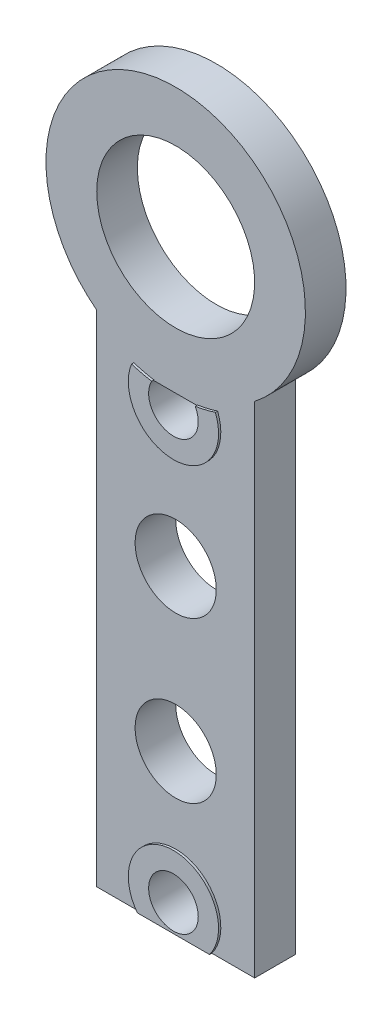
ISO-10303-21;
HEADER;
FILE_DESCRIPTION(('STEP AP214'),'2;1');
FILE_NAME('part.step','',(''),(''),'','','');
FILE_SCHEMA(('AUTOMOTIVE_DESIGN { 1 0 10303 214 1 1 1 1 }'));
ENDSEC;
DATA;
#1=APPLICATION_CONTEXT('core data for automotive mechanical design processes');
#2=APPLICATION_PROTOCOL_DEFINITION('international standard','automotive_design',2000,#1);
#3=PRODUCT_CONTEXT('',#1,'mechanical');
#4=PRODUCT('Part','Part','',(#3));
#5=PRODUCT_RELATED_PRODUCT_CATEGORY('part','',(#4));
#6=PRODUCT_DEFINITION_FORMATION('','',#4);
#7=PRODUCT_DEFINITION_CONTEXT('part definition',#1,'design');
#8=PRODUCT_DEFINITION('design','',#6,#7);
#9=PRODUCT_DEFINITION_SHAPE('','',#8);
#10=(LENGTH_UNIT() NAMED_UNIT(*) SI_UNIT(.MILLI.,.METRE.));
#11=(NAMED_UNIT(*) PLANE_ANGLE_UNIT() SI_UNIT($,.RADIAN.));
#12=(NAMED_UNIT(*) SI_UNIT($,.STERADIAN.) SOLID_ANGLE_UNIT());
#13=UNCERTAINTY_MEASURE_WITH_UNIT(LENGTH_MEASURE(1.E-05),#10,'distance_accuracy_value','');
#14=(GEOMETRIC_REPRESENTATION_CONTEXT(3) GLOBAL_UNCERTAINTY_ASSIGNED_CONTEXT((#13)) GLOBAL_UNIT_ASSIGNED_CONTEXT((#10,
#11,#12)) REPRESENTATION_CONTEXT('',''));
#15=CARTESIAN_POINT('',(0.,0.,0.));
#16=DIRECTION('',(0.,0.,1.));
#17=DIRECTION('',(1.,0.,0.));
#18=AXIS2_PLACEMENT_3D('',#15,#16,#17);
#19=CARTESIAN_POINT('',(-32.018684277368,-28.5,38.));
#20=DIRECTION('',(0.,0.,-1.));
#21=DIRECTION('',(-1.,0.,0.));
#22=AXIS2_PLACEMENT_3D('',#19,#20,#21);
#23=CYLINDRICAL_SURFACE('',#22,1.1);
#24=CARTESIAN_POINT('',(-32.018684277368,-28.5,35.));
#25=DIRECTION('',(0.,0.,1.));
#26=DIRECTION('',(1.,0.,0.));
#27=AXIS2_PLACEMENT_3D('',#24,#25,#26);
#28=CIRCLE('',#27,1.1);
#29=CARTESIAN_POINT('',(-31.0534155324063,-27.9725,35.));
#30=VERTEX_POINT('',#29);
#31=CARTESIAN_POINT('',(-32.9839530223297,-27.9725,35.));
#32=VERTEX_POINT('',#31);
#33=EDGE_CURVE('E174',#30,#32,#28,.F.);
#34=ORIENTED_EDGE('',*,*,#33,.F.);
#35=DIRECTION('',(0.,0.,-1.));
#36=VECTOR('',#35,1.);
#37=CARTESIAN_POINT('',(-31.0534155324063,-27.9725,36.05));
#38=LINE('',#37,#36);
#39=CARTESIAN_POINT('',(-31.0534155324063,-27.9725,34.9));
#40=VERTEX_POINT('',#39);
#41=EDGE_CURVE('E192',#30,#40,#38,.T.);
#42=ORIENTED_EDGE('',*,*,#41,.T.);
#43=CARTESIAN_POINT('',(-32.018684277368,-28.5,34.9));
#44=DIRECTION('',(0.,0.,1.));
#45=DIRECTION('',(1.,0.,0.));
#46=AXIS2_PLACEMENT_3D('',#43,#44,#45);
#47=CIRCLE('',#46,1.1);
#48=CARTESIAN_POINT('',(-31.0388883802547,-28.,34.9));
#49=VERTEX_POINT('',#48);
#50=EDGE_CURVE('E185',#49,#40,#47,.T.);
#51=ORIENTED_EDGE('',*,*,#50,.F.);
#52=DIRECTION('',(0.,0.,-1.));
#53=VECTOR('',#52,1.);
#54=CARTESIAN_POINT('',(-31.0388883802547,-28.,38.));
#55=LINE('',#54,#53);
#56=CARTESIAN_POINT('',(-31.0388883802547,-28.,33.1));
#57=VERTEX_POINT('',#56);
#58=EDGE_CURVE('E11',#49,#57,#55,.T.);
#59=ORIENTED_EDGE('',*,*,#58,.T.);
#60=CARTESIAN_POINT('',(-32.018684277368,-28.5,33.1));
#61=DIRECTION('',(0.,0.,-1.));
#62=DIRECTION('',(-1.,0.,0.));
#63=AXIS2_PLACEMENT_3D('',#60,#61,#62);
#64=CIRCLE('',#63,1.1);
#65=CARTESIAN_POINT('',(-32.9984801744813,-28.,33.1));
#66=VERTEX_POINT('',#65);
#67=EDGE_CURVE('E177',#66,#57,#64,.F.);
#68=ORIENTED_EDGE('',*,*,#67,.F.);
#69=DIRECTION('',(0.,0.,-1.));
#70=VECTOR('',#69,1.);
#71=CARTESIAN_POINT('',(-32.9984801744813,-28.,38.));
#72=LINE('',#71,#70);
#73=CARTESIAN_POINT('',(-32.9984801744813,-28.,34.9));
#74=VERTEX_POINT('',#73);
#75=EDGE_CURVE('E50',#66,#74,#72,.F.);
#76=ORIENTED_EDGE('',*,*,#75,.T.);
#77=CARTESIAN_POINT('',(-32.9839530223297,-27.9725,34.9));
#78=VERTEX_POINT('',#77);
#79=EDGE_CURVE('E184',#78,#74,#47,.T.);
#80=ORIENTED_EDGE('',*,*,#79,.F.);
#81=DIRECTION('',(0.,0.,-1.));
#82=VECTOR('',#81,1.);
#83=CARTESIAN_POINT('',(-32.9839530223297,-27.9725,36.05));
#84=LINE('',#83,#82);
#85=EDGE_CURVE('E135',#78,#32,#84,.F.);
#86=ORIENTED_EDGE('',*,*,#85,.T.);
#87=EDGE_LOOP('',(#34,#42,#51,#59,#68,#76,#80,#86));
#88=FACE_BOUND('',#87,.T.);
#89=ADVANCED_FACE('F41',(#88),#23,.F.);
#90=CARTESIAN_POINT('',(-32.018684277368,-28.5,35.));
#91=DIRECTION('',(0.,0.,-1.));
#92=DIRECTION('',(-1.,0.,0.));
#93=AXIS2_PLACEMENT_3D('',#90,#91,#92);
#94=CYLINDRICAL_SURFACE('',#93,2.);
#95=DIRECTION('',(0.,0.,-1.));
#96=VECTOR('',#95,1.);
#97=CARTESIAN_POINT('',(-30.1614646468673,-27.7578846153846,36.05));
#98=LINE('',#97,#96);
#99=CARTESIAN_POINT('',(-30.1614646468673,-27.7578846153846,35.));
#100=VERTEX_POINT('',#99);
#101=CARTESIAN_POINT('',(-30.1614646468673,-27.7578846153846,34.9));
#102=VERTEX_POINT('',#101);
#103=EDGE_CURVE('E210',#100,#102,#98,.T.);
#104=ORIENTED_EDGE('',*,*,#103,.F.);
#105=CARTESIAN_POINT('',(-32.018684277368,-28.5,35.));
#106=DIRECTION('',(0.,0.,1.));
#107=DIRECTION('',(1.,0.,0.));
#108=AXIS2_PLACEMENT_3D('',#105,#106,#107);
#109=CIRCLE('',#108,2.);
#110=CARTESIAN_POINT('',(-33.8759039078687,-27.7578846153846,35.));
#111=VERTEX_POINT('',#110);
#112=EDGE_CURVE('E149',#111,#100,#109,.T.);
#113=ORIENTED_EDGE('',*,*,#112,.F.);
#114=DIRECTION('',(0.,0.,-1.));
#115=VECTOR('',#114,1.);
#116=CARTESIAN_POINT('',(-33.8759039078687,-27.7578846153846,36.05));
#117=LINE('',#116,#115);
#118=CARTESIAN_POINT('',(-33.8759039078687,-27.7578846153846,34.9));
#119=VERTEX_POINT('',#118);
#120=EDGE_CURVE('E58',#119,#111,#117,.F.);
#121=ORIENTED_EDGE('',*,*,#120,.F.);
#122=CARTESIAN_POINT('',(-32.018684277368,-28.5,34.9));
#123=DIRECTION('',(0.,0.,1.));
#124=DIRECTION('',(1.,0.,0.));
#125=AXIS2_PLACEMENT_3D('',#122,#123,#124);
#126=CIRCLE('',#125,2.);
#127=EDGE_CURVE('E147',#119,#102,#126,.T.);
#128=ORIENTED_EDGE('',*,*,#127,.T.);
#129=EDGE_LOOP('',(#104,#113,#121,#128));
#130=FACE_BOUND('',#129,.T.);
#131=ADVANCED_FACE('F146',(#130),#94,.T.);
#132=CARTESIAN_POINT('',(-35.518684277368,-49.5,34.9));
#133=DIRECTION('',(1.,0.,0.));
#134=DIRECTION('',(0.,0.,-1.));
#135=AXIS2_PLACEMENT_3D('',#132,#133,#134);
#136=PLANE('',#135);
#137=DIRECTION('',(0.,0.,-1.));
#138=VECTOR('',#137,1.);
#139=CARTESIAN_POINT('',(-35.518684277368,-26.5620718977237,34.9));
#140=LINE('',#139,#138);
#141=CARTESIAN_POINT('',(-35.518684277368,-26.5620718977237,33.1));
#142=VERTEX_POINT('',#141);
#143=CARTESIAN_POINT('',(-35.518684277368,-26.5620718977237,34.9));
#144=VERTEX_POINT('',#143);
#145=EDGE_CURVE('E224',#142,#144,#140,.F.);
#146=ORIENTED_EDGE('',*,*,#145,.F.);
#147=DIRECTION('',(0.,-1.,0.));
#148=VECTOR('',#147,1.);
#149=CARTESIAN_POINT('',(-35.518684277368,-49.5,33.1));
#150=LINE('',#149,#148);
#151=CARTESIAN_POINT('',(-35.518684277368,-48.7,33.1));
#152=VERTEX_POINT('',#151);
#153=EDGE_CURVE('E165',#142,#152,#150,.T.);
#154=ORIENTED_EDGE('',*,*,#153,.T.);
#155=DIRECTION('',(0.,0.,-1.));
#156=VECTOR('',#155,1.);
#157=CARTESIAN_POINT('',(-35.518684277368,-48.7,34.9));
#158=LINE('',#157,#156);
#159=CARTESIAN_POINT('',(-35.518684277368,-48.7,34.9));
#160=VERTEX_POINT('',#159);
#161=EDGE_CURVE('E241',#160,#152,#158,.T.);
#162=ORIENTED_EDGE('',*,*,#161,.F.);
#163=DIRECTION('',(0.,-1.,0.));
#164=VECTOR('',#163,1.);
#165=CARTESIAN_POINT('',(-35.518684277368,-49.5,34.9));
#166=LINE('',#165,#164);
#167=EDGE_CURVE('E167',#144,#160,#166,.T.);
#168=ORIENTED_EDGE('',*,*,#167,.F.);
#169=EDGE_LOOP('',(#146,#154,#162,#168));
#170=FACE_BOUND('',#169,.T.);
#171=ADVANCED_FACE('F43',(#170),#136,.F.);
#172=CARTESIAN_POINT('',(-28.518684277368,-49.5,34.9));
#173=DIRECTION('',(-1.,0.,0.));
#174=DIRECTION('',(0.,0.,1.));
#175=AXIS2_PLACEMENT_3D('',#172,#173,#174);
#176=PLANE('',#175);
#177=DIRECTION('',(0.,0.,-1.));
#178=VECTOR('',#177,1.);
#179=CARTESIAN_POINT('',(-28.518684277368,-26.5620718977237,34.9));
#180=LINE('',#179,#178);
#181=CARTESIAN_POINT('',(-28.518684277368,-26.5620718977237,34.9));
#182=VERTEX_POINT('',#181);
#183=CARTESIAN_POINT('',(-28.518684277368,-26.5620718977237,33.1));
#184=VERTEX_POINT('',#183);
#185=EDGE_CURVE('E219',#182,#184,#180,.T.);
#186=ORIENTED_EDGE('',*,*,#185,.F.);
#187=DIRECTION('',(0.,1.,0.));
#188=VECTOR('',#187,1.);
#189=CARTESIAN_POINT('',(-28.518684277368,-49.5,34.9));
#190=LINE('',#189,#188);
#191=CARTESIAN_POINT('',(-28.518684277368,-48.7,34.9));
#192=VERTEX_POINT('',#191);
#193=EDGE_CURVE('E66',#192,#182,#190,.T.);
#194=ORIENTED_EDGE('',*,*,#193,.F.);
#195=DIRECTION('',(0.,0.,1.));
#196=VECTOR('',#195,1.);
#197=CARTESIAN_POINT('',(-28.518684277368,-48.7,34.9));
#198=LINE('',#197,#196);
#199=CARTESIAN_POINT('',(-28.518684277368,-48.7,33.1));
#200=VERTEX_POINT('',#199);
#201=EDGE_CURVE('E239',#200,#192,#198,.T.);
#202=ORIENTED_EDGE('',*,*,#201,.F.);
#203=DIRECTION('',(0.,1.,0.));
#204=VECTOR('',#203,1.);
#205=CARTESIAN_POINT('',(-28.518684277368,-49.5,33.1));
#206=LINE('',#205,#204);
#207=EDGE_CURVE('E169',#200,#184,#206,.T.);
#208=ORIENTED_EDGE('',*,*,#207,.T.);
#209=EDGE_LOOP('',(#186,#194,#202,#208));
#210=FACE_BOUND('',#209,.T.);
#211=ADVANCED_FACE('F297',(#210),#176,.F.);
#212=CARTESIAN_POINT('',(0.,0.,34.9));
#213=DIRECTION('',(0.,0.,-1.));
#214=DIRECTION('',(-1.,0.,0.));
#215=AXIS2_PLACEMENT_3D('',#212,#213,#214);
#216=PLANE('',#215);
#217=CARTESIAN_POINT('',(-32.018684277368,-34.6434023405005,34.9));
#218=DIRECTION('',(0.,0.,-1.));
#219=DIRECTION('',(-1.,0.,0.));
#220=AXIS2_PLACEMENT_3D('',#217,#218,#219);
#221=CIRCLE('',#220,1.8);
#222=CARTESIAN_POINT('',(-33.818684277368,-34.6434023405005,34.9));
#223=VERTEX_POINT('',#222);
#224=EDGE_CURVE('E196',#223,#223,#221,.F.);
#225=ORIENTED_EDGE('',*,*,#224,.F.);
#226=EDGE_LOOP('',(#225));
#227=FACE_BOUND('',#226,.T.);
#228=CARTESIAN_POINT('',(-32.018684277368,-41.7454165571395,34.9));
#229=DIRECTION('',(0.,0.,-1.));
#230=DIRECTION('',(-1.,0.,0.));
#231=AXIS2_PLACEMENT_3D('',#228,#229,#230);
#232=CIRCLE('',#231,1.8);
#233=CARTESIAN_POINT('',(-33.818684277368,-41.7454165571395,34.9));
#234=VERTEX_POINT('',#233);
#235=EDGE_CURVE('E195',#234,#234,#232,.F.);
#236=ORIENTED_EDGE('',*,*,#235,.F.);
#237=EDGE_LOOP('',(#236));
#238=FACE_BOUND('',#237,.T.);
#239=ORIENTED_EDGE('',*,*,#127,.F.);
#240=CARTESIAN_POINT('',(-32.018684277368,-22.,34.9));
#241=DIRECTION('',(0.,0.,1.));
#242=DIRECTION('',(1.,0.,0.));
#243=AXIS2_PLACEMENT_3D('',#240,#241,#242);
#244=CIRCLE('',#243,6.05);
#245=EDGE_CURVE('E132',#119,#78,#244,.T.);
#246=ORIENTED_EDGE('',*,*,#245,.T.);
#247=ORIENTED_EDGE('',*,*,#79,.T.);
#248=DIRECTION('',(1.,0.,0.));
#249=VECTOR('',#248,1.);
#250=CARTESIAN_POINT('',(-35.518684277368,-28.,34.9));
#251=LINE('',#250,#249);
#252=EDGE_CURVE('E228',#74,#49,#251,.T.);
#253=ORIENTED_EDGE('',*,*,#252,.T.);
#254=ORIENTED_EDGE('',*,*,#50,.T.);
#255=EDGE_CURVE('E140',#40,#102,#244,.T.);
#256=ORIENTED_EDGE('',*,*,#255,.T.);
#257=EDGE_LOOP('',(#239,#246,#247,#253,#254,#256));
#258=FACE_BOUND('',#257,.T.);
#259=ORIENTED_EDGE('',*,*,#167,.T.);
#260=DIRECTION('',(-1.,0.,0.));
#261=VECTOR('',#260,1.);
#262=CARTESIAN_POINT('',(0.,-48.7,34.9));
#263=LINE('',#262,#261);
#264=CARTESIAN_POINT('',(-33.618684277368,-48.7,34.9));
#265=VERTEX_POINT('',#264);
#266=EDGE_CURVE('E235',#265,#160,#263,.T.);
#267=ORIENTED_EDGE('',*,*,#266,.F.);
#268=CARTESIAN_POINT('',(-32.018684277368,-47.5,34.9));
#269=DIRECTION('',(0.,0.,1.));
#270=DIRECTION('',(1.,0.,0.));
#271=AXIS2_PLACEMENT_3D('',#268,#269,#270);
#272=CIRCLE('',#271,2.);
#273=CARTESIAN_POINT('',(-30.418684277368,-48.7,34.9));
#274=VERTEX_POINT('',#273);
#275=EDGE_CURVE('E154',#274,#265,#272,.T.);
#276=ORIENTED_EDGE('',*,*,#275,.F.);
#277=EDGE_CURVE('E238',#192,#274,#263,.T.);
#278=ORIENTED_EDGE('',*,*,#277,.F.);
#279=ORIENTED_EDGE('',*,*,#193,.T.);
#280=CARTESIAN_POINT('',(-32.018684277368,-22.,34.9));
#281=DIRECTION('',(0.,0.,1.));
#282=DIRECTION('',(1.,0.,0.));
#283=AXIS2_PLACEMENT_3D('',#280,#281,#282);
#284=CIRCLE('',#283,5.75);
#285=EDGE_CURVE('E217',#182,#144,#284,.T.);
#286=ORIENTED_EDGE('',*,*,#285,.T.);
#287=EDGE_LOOP('',(#259,#267,#276,#278,#279,#286));
#288=FACE_BOUND('',#287,.T.);
#289=CARTESIAN_POINT('',(-32.018684277368,-22.,34.9));
#290=DIRECTION('',(0.,0.,-1.));
#291=DIRECTION('',(-1.,0.,0.));
#292=AXIS2_PLACEMENT_3D('',#289,#290,#291);
#293=CIRCLE('',#292,3.5);
#294=CARTESIAN_POINT('',(-35.518684277368,-22.,34.9));
#295=VERTEX_POINT('',#294);
#296=EDGE_CURVE('E191',#295,#295,#293,.F.);
#297=ORIENTED_EDGE('',*,*,#296,.F.);
#298=EDGE_LOOP('',(#297));
#299=FACE_BOUND('',#298,.T.);
#300=ADVANCED_FACE('F152',(#227,#238,#258,#288,#299),#216,.F.);
#301=CARTESIAN_POINT('',(0.,0.,33.1));
#302=DIRECTION('',(0.,0.,-1.));
#303=DIRECTION('',(-1.,0.,0.));
#304=AXIS2_PLACEMENT_3D('',#301,#302,#303);
#305=PLANE('',#304);
#306=CARTESIAN_POINT('',(-32.018684277368,-34.6434023405005,33.1));
#307=DIRECTION('',(0.,0.,-1.));
#308=DIRECTION('',(-1.,0.,0.));
#309=AXIS2_PLACEMENT_3D('',#306,#307,#308);
#310=CIRCLE('',#309,1.8);
#311=CARTESIAN_POINT('',(-33.818684277368,-34.6434023405005,33.1));
#312=VERTEX_POINT('',#311);
#313=EDGE_CURVE('E45',#312,#312,#310,.F.);
#314=ORIENTED_EDGE('',*,*,#313,.T.);
#315=EDGE_LOOP('',(#314));
#316=FACE_BOUND('',#315,.T.);
#317=CARTESIAN_POINT('',(-32.018684277368,-41.7454165571395,33.1));
#318=DIRECTION('',(0.,0.,-1.));
#319=DIRECTION('',(-1.,0.,0.));
#320=AXIS2_PLACEMENT_3D('',#317,#318,#319);
#321=CIRCLE('',#320,1.8);
#322=CARTESIAN_POINT('',(-33.818684277368,-41.7454165571395,33.1));
#323=VERTEX_POINT('',#322);
#324=EDGE_CURVE('E193',#323,#323,#321,.F.);
#325=ORIENTED_EDGE('',*,*,#324,.T.);
#326=EDGE_LOOP('',(#325));
#327=FACE_BOUND('',#326,.T.);
#328=CARTESIAN_POINT('',(-32.018684277368,-22.,33.1));
#329=DIRECTION('',(0.,0.,-1.));
#330=DIRECTION('',(-1.,0.,0.));
#331=AXIS2_PLACEMENT_3D('',#328,#329,#330);
#332=CIRCLE('',#331,3.5);
#333=CARTESIAN_POINT('',(-35.518684277368,-22.,33.1));
#334=VERTEX_POINT('',#333);
#335=EDGE_CURVE('E189',#334,#334,#332,.F.);
#336=ORIENTED_EDGE('',*,*,#335,.T.);
#337=EDGE_LOOP('',(#336));
#338=FACE_BOUND('',#337,.T.);
#339=ORIENTED_EDGE('',*,*,#153,.F.);
#340=CARTESIAN_POINT('',(-32.018684277368,-22.,33.1));
#341=DIRECTION('',(0.,0.,1.));
#342=DIRECTION('',(1.,0.,0.));
#343=AXIS2_PLACEMENT_3D('',#340,#341,#342);
#344=CIRCLE('',#343,5.75);
#345=EDGE_CURVE('E216',#184,#142,#344,.T.);
#346=ORIENTED_EDGE('',*,*,#345,.F.);
#347=ORIENTED_EDGE('',*,*,#207,.F.);
#348=DIRECTION('',(-1.,0.,0.));
#349=VECTOR('',#348,1.);
#350=CARTESIAN_POINT('',(0.,-48.7,33.1));
#351=LINE('',#350,#349);
#352=EDGE_CURVE('E178',#200,#152,#351,.T.);
#353=ORIENTED_EDGE('',*,*,#352,.T.);
#354=EDGE_LOOP('',(#339,#346,#347,#353));
#355=FACE_BOUND('',#354,.T.);
#356=DIRECTION('',(1.,0.,0.));
#357=VECTOR('',#356,1.);
#358=CARTESIAN_POINT('',(-35.518684277368,-28.,33.1));
#359=LINE('',#358,#357);
#360=EDGE_CURVE('E227',#66,#57,#359,.T.);
#361=ORIENTED_EDGE('',*,*,#360,.F.);
#362=ORIENTED_EDGE('',*,*,#67,.T.);
#363=EDGE_LOOP('',(#361,#362));
#364=FACE_BOUND('',#363,.T.);
#365=CARTESIAN_POINT('',(-32.018684277368,-47.5,33.1));
#366=DIRECTION('',(0.,0.,-1.));
#367=DIRECTION('',(-1.,0.,0.));
#368=AXIS2_PLACEMENT_3D('',#365,#366,#367);
#369=CIRCLE('',#368,1.1);
#370=CARTESIAN_POINT('',(-33.118684277368,-47.5,33.1));
#371=VERTEX_POINT('',#370);
#372=EDGE_CURVE('E159',#371,#371,#369,.F.);
#373=ORIENTED_EDGE('',*,*,#372,.T.);
#374=EDGE_LOOP('',(#373));
#375=FACE_BOUND('',#374,.T.);
#376=ADVANCED_FACE('F248',(#316,#327,#338,#355,#364,#375),#305,.T.);
#377=CARTESIAN_POINT('',(-32.018684277368,-47.5,35.));
#378=DIRECTION('',(0.,0.,-1.));
#379=DIRECTION('',(-1.,0.,0.));
#380=AXIS2_PLACEMENT_3D('',#377,#378,#379);
#381=CYLINDRICAL_SURFACE('',#380,2.);
#382=DIRECTION('',(0.,0.,-1.));
#383=VECTOR('',#382,1.);
#384=CARTESIAN_POINT('',(-33.618684277368,-48.7,35.));
#385=LINE('',#384,#383);
#386=CARTESIAN_POINT('',(-33.618684277368,-48.7,35.));
#387=VERTEX_POINT('',#386);
#388=EDGE_CURVE('E233',#387,#265,#385,.T.);
#389=ORIENTED_EDGE('',*,*,#388,.F.);
#390=CARTESIAN_POINT('',(-32.018684277368,-47.5,35.));
#391=DIRECTION('',(0.,0.,1.));
#392=DIRECTION('',(1.,0.,0.));
#393=AXIS2_PLACEMENT_3D('',#390,#391,#392);
#394=CIRCLE('',#393,2.);
#395=CARTESIAN_POINT('',(-30.418684277368,-48.7,35.));
#396=VERTEX_POINT('',#395);
#397=EDGE_CURVE('E157',#396,#387,#394,.T.);
#398=ORIENTED_EDGE('',*,*,#397,.F.);
#399=DIRECTION('',(0.,0.,-1.));
#400=VECTOR('',#399,1.);
#401=CARTESIAN_POINT('',(-30.418684277368,-48.7,35.));
#402=LINE('',#401,#400);
#403=EDGE_CURVE('E230',#274,#396,#402,.F.);
#404=ORIENTED_EDGE('',*,*,#403,.F.);
#405=ORIENTED_EDGE('',*,*,#275,.T.);
#406=EDGE_LOOP('',(#389,#398,#404,#405));
#407=FACE_BOUND('',#406,.T.);
#408=ADVANCED_FACE('F290',(#407),#381,.T.);
#409=CARTESIAN_POINT('',(-32.018684277368,-47.5,35.));
#410=DIRECTION('',(0.,0.,1.));
#411=DIRECTION('',(1.,0.,0.));
#412=AXIS2_PLACEMENT_3D('',#409,#410,#411);
#413=PLANE('',#412);
#414=CARTESIAN_POINT('',(-32.018684277368,-47.5,35.));
#415=DIRECTION('',(0.,0.,1.));
#416=DIRECTION('',(1.,0.,0.));
#417=AXIS2_PLACEMENT_3D('',#414,#415,#416);
#418=CIRCLE('',#417,1.1);
#419=CARTESIAN_POINT('',(-30.918684277368,-47.5,35.));
#420=VERTEX_POINT('',#419);
#421=EDGE_CURVE('E179',#420,#420,#418,.F.);
#422=ORIENTED_EDGE('',*,*,#421,.T.);
#423=EDGE_LOOP('',(#422));
#424=FACE_BOUND('',#423,.T.);
#425=ORIENTED_EDGE('',*,*,#397,.T.);
#426=DIRECTION('',(1.,0.,0.));
#427=VECTOR('',#426,1.);
#428=CARTESIAN_POINT('',(-32.018684277368,-48.7,35.));
#429=LINE('',#428,#427);
#430=EDGE_CURVE('E171',#387,#396,#429,.T.);
#431=ORIENTED_EDGE('',*,*,#430,.T.);
#432=EDGE_LOOP('',(#425,#431));
#433=FACE_BOUND('',#432,.T.);
#434=ADVANCED_FACE('F287',(#424,#433),#413,.T.);
#435=CARTESIAN_POINT('',(-32.018684277368,-28.5,35.));
#436=DIRECTION('',(0.,0.,1.));
#437=DIRECTION('',(1.,0.,0.));
#438=AXIS2_PLACEMENT_3D('',#435,#436,#437);
#439=PLANE('',#438);
#440=ORIENTED_EDGE('',*,*,#112,.T.);
#441=CARTESIAN_POINT('',(-32.018684277368,-22.,35.));
#442=DIRECTION('',(0.,0.,1.));
#443=DIRECTION('',(1.,0.,0.));
#444=AXIS2_PLACEMENT_3D('',#441,#442,#443);
#445=CIRCLE('',#444,6.05);
#446=EDGE_CURVE('E207',#100,#30,#445,.F.);
#447=ORIENTED_EDGE('',*,*,#446,.T.);
#448=ORIENTED_EDGE('',*,*,#33,.T.);
#449=EDGE_CURVE('E139',#32,#111,#445,.F.);
#450=ORIENTED_EDGE('',*,*,#449,.T.);
#451=EDGE_LOOP('',(#440,#447,#448,#450));
#452=FACE_BOUND('',#451,.T.);
#453=ADVANCED_FACE('F260',(#452),#439,.T.);
#454=CARTESIAN_POINT('',(-32.018684277368,-47.5,38.));
#455=DIRECTION('',(0.,0.,-1.));
#456=DIRECTION('',(-1.,0.,0.));
#457=AXIS2_PLACEMENT_3D('',#454,#455,#456);
#458=CYLINDRICAL_SURFACE('',#457,1.1);
#459=ORIENTED_EDGE('',*,*,#372,.F.);
#460=EDGE_LOOP('',(#459));
#461=FACE_BOUND('',#460,.T.);
#462=ORIENTED_EDGE('',*,*,#421,.F.);
#463=EDGE_LOOP('',(#462));
#464=FACE_BOUND('',#463,.T.);
#465=ADVANCED_FACE('F282',(#461,#464),#458,.F.);
#466=CARTESIAN_POINT('',(-25.,-48.7,39.));
#467=DIRECTION('',(0.,-1.,0.));
#468=DIRECTION('',(0.,0.,-1.));
#469=AXIS2_PLACEMENT_3D('',#466,#467,#468);
#470=PLANE('',#469);
#471=ORIENTED_EDGE('',*,*,#201,.T.);
#472=ORIENTED_EDGE('',*,*,#277,.T.);
#473=ORIENTED_EDGE('',*,*,#403,.T.);
#474=ORIENTED_EDGE('',*,*,#430,.F.);
#475=ORIENTED_EDGE('',*,*,#388,.T.);
#476=ORIENTED_EDGE('',*,*,#266,.T.);
#477=ORIENTED_EDGE('',*,*,#161,.T.);
#478=ORIENTED_EDGE('',*,*,#352,.F.);
#479=EDGE_LOOP('',(#471,#472,#473,#474,#475,#476,#477,#478));
#480=FACE_BOUND('',#479,.T.);
#481=ADVANCED_FACE('F317',(#480),#470,.T.);
#482=CARTESIAN_POINT('',(-35.518684277368,-28.,34.9));
#483=DIRECTION('',(0.,1.,0.));
#484=DIRECTION('',(0.,0.,1.));
#485=AXIS2_PLACEMENT_3D('',#482,#483,#484);
#486=PLANE('',#485);
#487=ORIENTED_EDGE('',*,*,#58,.F.);
#488=ORIENTED_EDGE('',*,*,#252,.F.);
#489=ORIENTED_EDGE('',*,*,#75,.F.);
#490=ORIENTED_EDGE('',*,*,#360,.T.);
#491=EDGE_LOOP('',(#487,#488,#489,#490));
#492=FACE_BOUND('',#491,.T.);
#493=ADVANCED_FACE('F257',(#492),#486,.F.);
#494=CARTESIAN_POINT('',(-32.018684277368,-22.,34.9));
#495=DIRECTION('',(0.,0.,-1.));
#496=DIRECTION('',(-1.,0.,0.));
#497=AXIS2_PLACEMENT_3D('',#494,#495,#496);
#498=CYLINDRICAL_SURFACE('',#497,5.75);
#499=ORIENTED_EDGE('',*,*,#345,.T.);
#500=ORIENTED_EDGE('',*,*,#145,.T.);
#501=ORIENTED_EDGE('',*,*,#285,.F.);
#502=ORIENTED_EDGE('',*,*,#185,.T.);
#503=EDGE_LOOP('',(#499,#500,#501,#502));
#504=FACE_BOUND('',#503,.T.);
#505=ADVANCED_FACE('F271',(#504),#498,.T.);
#506=CARTESIAN_POINT('',(-32.018684277368,-22.,35.3));
#507=DIRECTION('',(0.,0.,-1.));
#508=DIRECTION('',(-1.,0.,0.));
#509=AXIS2_PLACEMENT_3D('',#506,#507,#508);
#510=CYLINDRICAL_SURFACE('',#509,3.5);
#511=ORIENTED_EDGE('',*,*,#335,.F.);
#512=EDGE_LOOP('',(#511));
#513=FACE_BOUND('',#512,.T.);
#514=ORIENTED_EDGE('',*,*,#296,.T.);
#515=EDGE_LOOP('',(#514));
#516=FACE_BOUND('',#515,.T.);
#517=ADVANCED_FACE('F264',(#513,#516),#510,.F.);
#518=CARTESIAN_POINT('',(-32.018684277368,-22.,37.2));
#519=DIRECTION('',(0.,0.,-1.));
#520=DIRECTION('',(-1.,0.,0.));
#521=AXIS2_PLACEMENT_3D('',#518,#519,#520);
#522=CYLINDRICAL_SURFACE('',#521,6.05);
#523=ORIENTED_EDGE('',*,*,#446,.F.);
#524=ORIENTED_EDGE('',*,*,#103,.T.);
#525=ORIENTED_EDGE('',*,*,#255,.F.);
#526=ORIENTED_EDGE('',*,*,#41,.F.);
#527=EDGE_LOOP('',(#523,#524,#525,#526));
#528=FACE_BOUND('',#527,.T.);
#529=ADVANCED_FACE('F262',(#528),#522,.F.);
#530=ORIENTED_EDGE('',*,*,#245,.F.);
#531=ORIENTED_EDGE('',*,*,#120,.T.);
#532=ORIENTED_EDGE('',*,*,#449,.F.);
#533=ORIENTED_EDGE('',*,*,#85,.F.);
#534=EDGE_LOOP('',(#530,#531,#532,#533));
#535=FACE_BOUND('',#534,.T.);
#536=ADVANCED_FACE('F133',(#535),#522,.F.);
#537=CARTESIAN_POINT('',(-32.018684277368,-41.7454165571395,35.));
#538=DIRECTION('',(0.,0.,-1.));
#539=DIRECTION('',(-1.,0.,0.));
#540=AXIS2_PLACEMENT_3D('',#537,#538,#539);
#541=CYLINDRICAL_SURFACE('',#540,1.8);
#542=ORIENTED_EDGE('',*,*,#324,.F.);
#543=EDGE_LOOP('',(#542));
#544=FACE_BOUND('',#543,.T.);
#545=ORIENTED_EDGE('',*,*,#235,.T.);
#546=EDGE_LOOP('',(#545));
#547=FACE_BOUND('',#546,.T.);
#548=ADVANCED_FACE('F270',(#544,#547),#541,.F.);
#549=CARTESIAN_POINT('',(-32.018684277368,-34.6434023405005,35.));
#550=DIRECTION('',(0.,0.,-1.));
#551=DIRECTION('',(-1.,0.,0.));
#552=AXIS2_PLACEMENT_3D('',#549,#550,#551);
#553=CYLINDRICAL_SURFACE('',#552,1.8);
#554=ORIENTED_EDGE('',*,*,#313,.F.);
#555=EDGE_LOOP('',(#554));
#556=FACE_BOUND('',#555,.T.);
#557=ORIENTED_EDGE('',*,*,#224,.T.);
#558=EDGE_LOOP('',(#557));
#559=FACE_BOUND('',#558,.T.);
#560=ADVANCED_FACE('F401',(#556,#559),#553,.F.);
#561=CLOSED_SHELL('',(#89,#131,#171,#211,#300,#376,#408,#434,#453,#465,#481,#493,#505,#517,#529,
#536,#548,#560));
#562=MANIFOLD_SOLID_BREP('B2',#561);
#563=ADVANCED_BREP_SHAPE_REPRESENTATION('',(#18,#562),#14);
#564=SHAPE_DEFINITION_REPRESENTATION(#9,#563);
ENDSEC;
END-ISO-10303-21;
